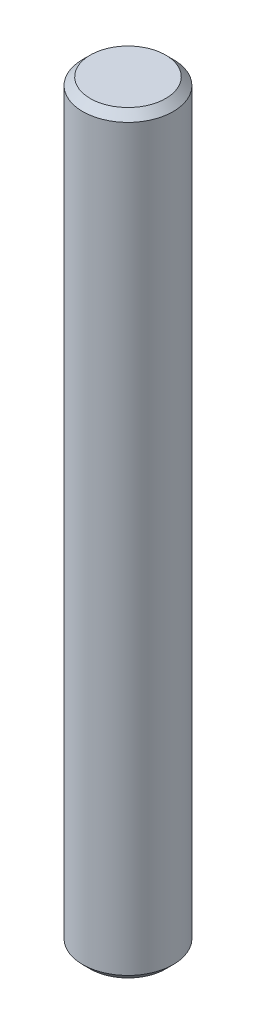
ISO-10303-21;
HEADER;
FILE_DESCRIPTION(('STEP AP214'),'2;1');
FILE_NAME('part.step','',(''),(''),'','','');
FILE_SCHEMA(('AUTOMOTIVE_DESIGN { 1 0 10303 214 1 1 1 1 }'));
ENDSEC;
DATA;
#1=APPLICATION_CONTEXT('core data for automotive mechanical design processes');
#2=APPLICATION_PROTOCOL_DEFINITION('international standard','automotive_design',2000,#1);
#3=PRODUCT_CONTEXT('',#1,'mechanical');
#4=PRODUCT('Part','Part','',(#3));
#5=PRODUCT_RELATED_PRODUCT_CATEGORY('part','',(#4));
#6=PRODUCT_DEFINITION_FORMATION('','',#4);
#7=PRODUCT_DEFINITION_CONTEXT('part definition',#1,'design');
#8=PRODUCT_DEFINITION('design','',#6,#7);
#9=PRODUCT_DEFINITION_SHAPE('','',#8);
#10=(LENGTH_UNIT() NAMED_UNIT(*) SI_UNIT(.MILLI.,.METRE.));
#11=(NAMED_UNIT(*) PLANE_ANGLE_UNIT() SI_UNIT($,.RADIAN.));
#12=(NAMED_UNIT(*) SI_UNIT($,.STERADIAN.) SOLID_ANGLE_UNIT());
#13=UNCERTAINTY_MEASURE_WITH_UNIT(LENGTH_MEASURE(1.E-05),#10,'distance_accuracy_value','');
#14=(GEOMETRIC_REPRESENTATION_CONTEXT(3) GLOBAL_UNCERTAINTY_ASSIGNED_CONTEXT((#13)) GLOBAL_UNIT_ASSIGNED_CONTEXT((#10,
#11,#12)) REPRESENTATION_CONTEXT('',''));
#15=CARTESIAN_POINT('',(0.,0.,0.));
#16=DIRECTION('',(0.,0.,1.));
#17=DIRECTION('',(1.,0.,0.));
#18=AXIS2_PLACEMENT_3D('',#15,#16,#17);
#19=CARTESIAN_POINT('',(0.,25.,0.));
#20=DIRECTION('',(0.,-1.,0.));
#21=DIRECTION('',(0.,0.,-1.));
#22=AXIS2_PLACEMENT_3D('',#19,#20,#21);
#23=CYLINDRICAL_SURFACE('',#22,1.5);
#24=CARTESIAN_POINT('',(0.,0.25,0.));
#25=DIRECTION('',(0.,1.,0.));
#26=DIRECTION('',(0.,0.,1.));
#27=AXIS2_PLACEMENT_3D('',#24,#25,#26);
#28=CIRCLE('',#27,1.5);
#29=CARTESIAN_POINT('',(0.,0.25,1.5));
#30=VERTEX_POINT('',#29);
#31=EDGE_CURVE('E45',#30,#30,#28,.T.);
#32=ORIENTED_EDGE('',*,*,#31,.T.);
#33=EDGE_LOOP('',(#32));
#34=FACE_BOUND('',#33,.T.);
#35=CARTESIAN_POINT('',(0.,24.75,0.));
#36=DIRECTION('',(0.,1.,0.));
#37=DIRECTION('',(0.,0.,1.));
#38=AXIS2_PLACEMENT_3D('',#35,#36,#37);
#39=CIRCLE('',#38,1.5);
#40=CARTESIAN_POINT('',(0.,24.75,1.5));
#41=VERTEX_POINT('',#40);
#42=EDGE_CURVE('E49',#41,#41,#39,.F.);
#43=ORIENTED_EDGE('',*,*,#42,.T.);
#44=EDGE_LOOP('',(#43));
#45=FACE_BOUND('',#44,.T.);
#46=ADVANCED_FACE('F33',(#34,#45),#23,.T.);
#47=CARTESIAN_POINT('',(0.,25.,0.));
#48=DIRECTION('',(0.,1.,0.));
#49=DIRECTION('',(0.,0.,1.));
#50=AXIS2_PLACEMENT_3D('',#47,#48,#49);
#51=PLANE('',#50);
#52=CARTESIAN_POINT('',(0.,25.,0.));
#53=DIRECTION('',(0.,1.,0.));
#54=DIRECTION('',(0.,0.,1.));
#55=AXIS2_PLACEMENT_3D('',#52,#53,#54);
#56=CIRCLE('',#55,1.25);
#57=CARTESIAN_POINT('',(0.,25.,1.25));
#58=VERTEX_POINT('',#57);
#59=EDGE_CURVE('E10',#58,#58,#56,.T.);
#60=ORIENTED_EDGE('',*,*,#59,.T.);
#61=EDGE_LOOP('',(#60));
#62=FACE_BOUND('',#61,.T.);
#63=ADVANCED_FACE('F65',(#62),#51,.T.);
#64=CARTESIAN_POINT('',(0.,0.,0.));
#65=DIRECTION('',(0.,1.,0.));
#66=DIRECTION('',(0.,0.,1.));
#67=AXIS2_PLACEMENT_3D('',#64,#65,#66);
#68=PLANE('',#67);
#69=CARTESIAN_POINT('',(0.,0.,0.));
#70=DIRECTION('',(0.,1.,0.));
#71=DIRECTION('',(0.,0.,1.));
#72=AXIS2_PLACEMENT_3D('',#69,#70,#71);
#73=CIRCLE('',#72,1.25);
#74=CARTESIAN_POINT('',(0.,0.,1.25));
#75=VERTEX_POINT('',#74);
#76=EDGE_CURVE('E41',#75,#75,#73,.F.);
#77=ORIENTED_EDGE('',*,*,#76,.T.);
#78=EDGE_LOOP('',(#77));
#79=FACE_BOUND('',#78,.T.);
#80=ADVANCED_FACE('F62',(#79),#68,.F.);
#81=CARTESIAN_POINT('',(0.,0.25,0.));
#82=DIRECTION('',(0.,1.,0.));
#83=DIRECTION('',(0.,0.,1.));
#84=AXIS2_PLACEMENT_3D('',#81,#82,#83);
#85=CONICAL_SURFACE('',#84,1.5,0.785398163397446);
#86=ORIENTED_EDGE('',*,*,#76,.F.);
#87=EDGE_LOOP('',(#86));
#88=FACE_BOUND('',#87,.T.);
#89=ORIENTED_EDGE('',*,*,#31,.F.);
#90=EDGE_LOOP('',(#89));
#91=FACE_BOUND('',#90,.T.);
#92=ADVANCED_FACE('F58',(#88,#91),#85,.T.);
#93=CARTESIAN_POINT('',(0.,25.,0.));
#94=DIRECTION('',(0.,-1.,0.));
#95=DIRECTION('',(0.,0.,-1.));
#96=AXIS2_PLACEMENT_3D('',#93,#94,#95);
#97=CONICAL_SURFACE('',#96,1.25,0.785398163397446);
#98=ORIENTED_EDGE('',*,*,#42,.F.);
#99=EDGE_LOOP('',(#98));
#100=FACE_BOUND('',#99,.T.);
#101=ORIENTED_EDGE('',*,*,#59,.F.);
#102=EDGE_LOOP('',(#101));
#103=FACE_BOUND('',#102,.T.);
#104=ADVANCED_FACE('F36',(#100,#103),#97,.T.);
#105=CLOSED_SHELL('',(#46,#63,#80,#92,#104));
#106=MANIFOLD_SOLID_BREP('B2',#105);
#107=ADVANCED_BREP_SHAPE_REPRESENTATION('',(#18,#106),#14);
#108=SHAPE_DEFINITION_REPRESENTATION(#9,#107);
ENDSEC;
END-ISO-10303-21;
